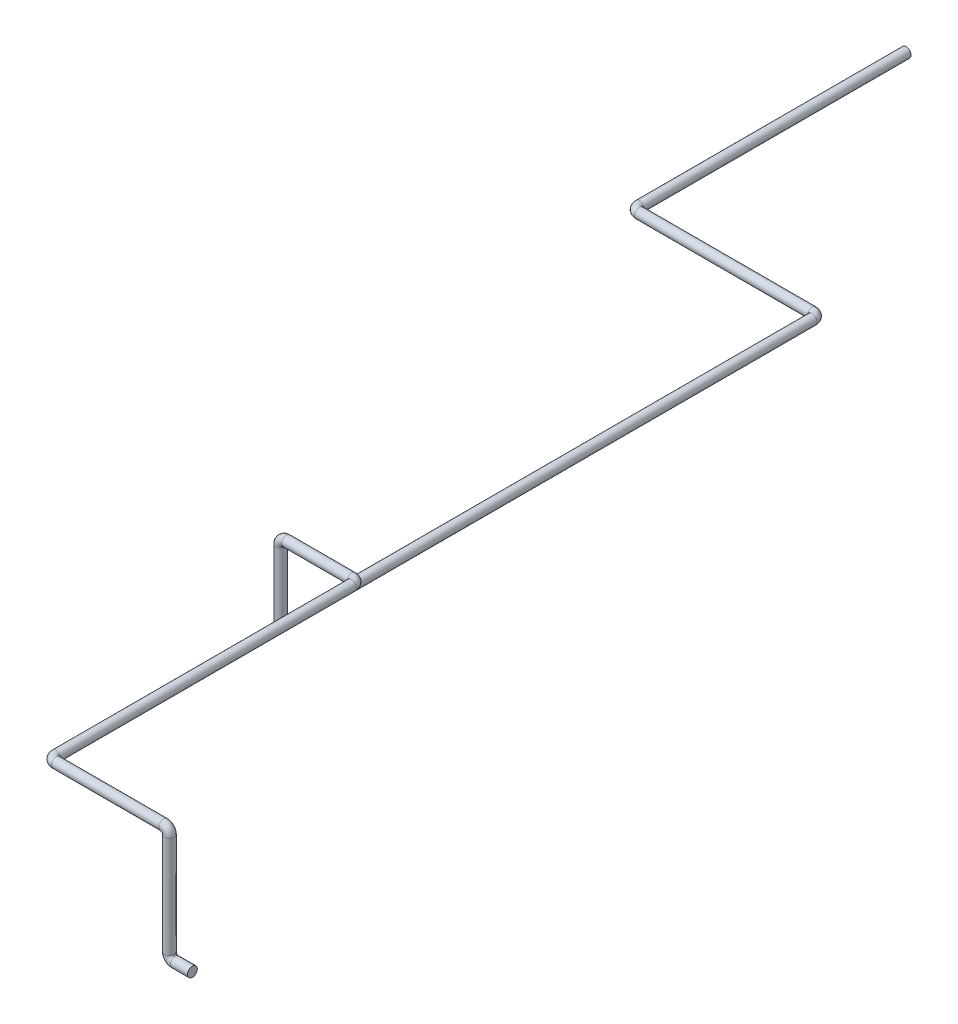
ISO-10303-21;
HEADER;
FILE_DESCRIPTION(('STEP AP214'),'2;1');
FILE_NAME('part.step','',(''),(''),'','','');
FILE_SCHEMA(('AUTOMOTIVE_DESIGN { 1 0 10303 214 1 1 1 1 }'));
ENDSEC;
DATA;
#1=APPLICATION_CONTEXT('core data for automotive mechanical design processes');
#2=APPLICATION_PROTOCOL_DEFINITION('international standard','automotive_design',2000,#1);
#3=PRODUCT_CONTEXT('',#1,'mechanical');
#4=PRODUCT('Part','Part','',(#3));
#5=PRODUCT_RELATED_PRODUCT_CATEGORY('part','',(#4));
#6=PRODUCT_DEFINITION_FORMATION('','',#4);
#7=PRODUCT_DEFINITION_CONTEXT('part definition',#1,'design');
#8=PRODUCT_DEFINITION('design','',#6,#7);
#9=PRODUCT_DEFINITION_SHAPE('','',#8);
#10=(LENGTH_UNIT() NAMED_UNIT(*) SI_UNIT(.MILLI.,.METRE.));
#11=(NAMED_UNIT(*) PLANE_ANGLE_UNIT() SI_UNIT($,.RADIAN.));
#12=(NAMED_UNIT(*) SI_UNIT($,.STERADIAN.) SOLID_ANGLE_UNIT());
#13=UNCERTAINTY_MEASURE_WITH_UNIT(LENGTH_MEASURE(1.E-05),#10,'distance_accuracy_value','');
#14=(GEOMETRIC_REPRESENTATION_CONTEXT(3) GLOBAL_UNCERTAINTY_ASSIGNED_CONTEXT((#13)) GLOBAL_UNIT_ASSIGNED_CONTEXT((#10,
#11,#12)) REPRESENTATION_CONTEXT('',''));
#15=CARTESIAN_POINT('',(0.,0.,0.));
#16=DIRECTION('',(0.,0.,1.));
#17=DIRECTION('',(1.,0.,0.));
#18=AXIS2_PLACEMENT_3D('',#15,#16,#17);
#19=CARTESIAN_POINT('',(0.,0.,10.));
#20=DIRECTION('',(0.,0.,-1.));
#21=DIRECTION('',(-1.,0.,0.));
#22=AXIS2_PLACEMENT_3D('',#19,#20,#21);
#23=CYLINDRICAL_SURFACE('',#22,12.7);
#24=CARTESIAN_POINT('',(0.,0.,0.999999999999999));
#25=DIRECTION('',(0.,0.,1.));
#26=DIRECTION('',(1.,0.,0.));
#27=AXIS2_PLACEMENT_3D('',#24,#25,#26);
#28=CIRCLE('',#27,12.7);
#29=CARTESIAN_POINT('',(0.0462735866728176,12.6999156987429,0.999999999999999));
#30=VERTEX_POINT('',#29);
#31=CARTESIAN_POINT('',(-0.0462735866728176,12.6999156987429,0.999999999999999));
#32=VERTEX_POINT('',#31);
#33=EDGE_CURVE('E11',#30,#32,#28,.T.);
#34=ORIENTED_EDGE('',*,*,#33,.T.);
#35=DIRECTION('',(0.,0.,-1.));
#36=VECTOR('',#35,1.);
#37=CARTESIAN_POINT('',(-0.0462735866728176,12.6999156987429,10.));
#38=LINE('',#37,#36);
#39=CARTESIAN_POINT('',(-0.0462735866728176,12.6999156987429,0.));
#40=VERTEX_POINT('',#39);
#41=EDGE_CURVE('E81',#32,#40,#38,.T.);
#42=ORIENTED_EDGE('',*,*,#41,.T.);
#43=CARTESIAN_POINT('',(0.,0.,0.));
#44=DIRECTION('',(0.,0.,1.));
#45=DIRECTION('',(1.,0.,0.));
#46=AXIS2_PLACEMENT_3D('',#43,#44,#45);
#47=CIRCLE('',#46,12.7);
#48=CARTESIAN_POINT('',(0.0462735866728176,12.6999156987429,0.));
#49=VERTEX_POINT('',#48);
#50=EDGE_CURVE('E42',#40,#49,#47,.T.);
#51=ORIENTED_EDGE('',*,*,#50,.T.);
#52=DIRECTION('',(0.,0.,-1.));
#53=VECTOR('',#52,1.);
#54=CARTESIAN_POINT('',(0.0462735866728176,12.6999156987429,10.));
#55=LINE('',#54,#53);
#56=EDGE_CURVE('E52',#49,#30,#55,.F.);
#57=ORIENTED_EDGE('',*,*,#56,.T.);
#58=EDGE_LOOP('',(#34,#42,#51,#57));
#59=FACE_BOUND('',#58,.T.);
#60=CARTESIAN_POINT('',(0.,0.,695.));
#61=DIRECTION('',(0.,0.,1.));
#62=DIRECTION('',(1.,0.,0.));
#63=AXIS2_PLACEMENT_3D('',#60,#61,#62);
#64=CIRCLE('',#63,12.7);
#65=CARTESIAN_POINT('',(-12.7000000000001,0.,695.));
#66=VERTEX_POINT('',#65);
#67=EDGE_CURVE('E109',#66,#66,#64,.T.);
#68=ORIENTED_EDGE('',*,*,#67,.F.);
#69=EDGE_LOOP('',(#68));
#70=FACE_BOUND('',#69,.T.);
#71=ADVANCED_FACE('F35',(#59,#70),#23,.T.);
#72=CARTESIAN_POINT('',(0.,0.,0.));
#73=DIRECTION('',(0.,0.,1.));
#74=DIRECTION('',(1.,0.,0.));
#75=AXIS2_PLACEMENT_3D('',#72,#73,#74);
#76=PLANE('',#75);
#77=ORIENTED_EDGE('',*,*,#50,.F.);
#78=DIRECTION('',(0.,1.,0.));
#79=VECTOR('',#78,1.);
#80=CARTESIAN_POINT('',(-0.0462735866728176,12.675138552317,0.));
#81=LINE('',#80,#79);
#82=CARTESIAN_POINT('',(-0.0462735866728176,12.724861447683,0.));
#83=VERTEX_POINT('',#82);
#84=EDGE_CURVE('E101',#40,#83,#81,.T.);
#85=ORIENTED_EDGE('',*,*,#84,.T.);
#86=DIRECTION('',(1.,0.,0.));
#87=VECTOR('',#86,1.);
#88=CARTESIAN_POINT('',(0.0462735866728176,12.724861447683,0.));
#89=LINE('',#88,#87);
#90=CARTESIAN_POINT('',(0.0462735866728176,12.724861447683,0.));
#91=VERTEX_POINT('',#90);
#92=EDGE_CURVE('E91',#83,#91,#89,.T.);
#93=ORIENTED_EDGE('',*,*,#92,.T.);
#94=DIRECTION('',(0.,-1.,0.));
#95=VECTOR('',#94,1.);
#96=CARTESIAN_POINT('',(0.0462735866728176,12.675138552317,0.));
#97=LINE('',#96,#95);
#98=EDGE_CURVE('E85',#91,#49,#97,.T.);
#99=ORIENTED_EDGE('',*,*,#98,.T.);
#100=EDGE_LOOP('',(#77,#85,#93,#99));
#101=FACE_BOUND('',#100,.T.);
#102=ADVANCED_FACE('F163',(#101),#76,.F.);
#103=CARTESIAN_POINT('',(1050.,-95.,2910.));
#104=DIRECTION('',(1.,0.,0.));
#105=DIRECTION('',(0.,-1.,0.));
#106=AXIS2_PLACEMENT_3D('',#103,#104,#105);
#107=PLANE('',#106);
#108=CARTESIAN_POINT('',(1050.,-95.,2910.));
#109=DIRECTION('',(1.,0.,0.));
#110=DIRECTION('',(0.,-1.,0.));
#111=AXIS2_PLACEMENT_3D('',#108,#109,#110);
#112=CIRCLE('',#111,12.7);
#113=CARTESIAN_POINT('',(1050.,-107.7,2910.));
#114=VERTEX_POINT('',#113);
#115=EDGE_CURVE('E157',#114,#114,#112,.T.);
#116=ORIENTED_EDGE('',*,*,#115,.T.);
#117=EDGE_LOOP('',(#116));
#118=FACE_BOUND('',#117,.T.);
#119=ADVANCED_FACE('F165',(#118),#107,.T.);
#120=CARTESIAN_POINT('',(15.,0.,695.));
#121=DIRECTION('',(0.,1.,0.));
#122=DIRECTION('',(0.,0.,1.));
#123=AXIS2_PLACEMENT_3D('',#120,#121,#122);
#124=TOROIDAL_SURFACE('',#123,15.0000000000001,12.7);
#125=CARTESIAN_POINT('',(15.,0.,710.));
#126=DIRECTION('',(1.,0.,0.));
#127=DIRECTION('',(0.,0.,-1.));
#128=AXIS2_PLACEMENT_3D('',#125,#126,#127);
#129=CIRCLE('',#128,12.7);
#130=CARTESIAN_POINT('',(15.,0.,722.7));
#131=VERTEX_POINT('',#130);
#132=EDGE_CURVE('E112',#131,#131,#129,.T.);
#133=CARTESIAN_POINT('',(15.,0.,695.));
#134=DIRECTION('',(0.,1.,0.));
#135=DIRECTION('',(0.,0.,1.));
#136=AXIS2_PLACEMENT_3D('',#133,#134,#135);
#137=CIRCLE('',#136,27.7000000000001);
#138=EDGE_CURVE('',#66,#131,#137,.T.);
#139=ORIENTED_EDGE('',*,*,#67,.T.);
#140=ORIENTED_EDGE('',*,*,#132,.F.);
#141=ORIENTED_EDGE('',*,*,#138,.T.);
#142=ORIENTED_EDGE('',*,*,#138,.F.);
#143=EDGE_LOOP('',(#139,#141,#140,#142));
#144=FACE_BOUND('',#143,.T.);
#145=ADVANCED_FACE('F171',(#144),#124,.T.);
#146=CARTESIAN_POINT('',(15.,0.,710.));
#147=DIRECTION('',(1.,0.,0.));
#148=DIRECTION('',(0.,0.,-1.));
#149=AXIS2_PLACEMENT_3D('',#146,#147,#148);
#150=CYLINDRICAL_SURFACE('',#149,12.7);
#151=CARTESIAN_POINT('',(465.,0.,710.));
#152=DIRECTION('',(1.,0.,0.));
#153=DIRECTION('',(0.,0.,-1.));
#154=AXIS2_PLACEMENT_3D('',#151,#152,#153);
#155=CIRCLE('',#154,12.7);
#156=CARTESIAN_POINT('',(465.,0.,697.3));
#157=VERTEX_POINT('',#156);
#158=EDGE_CURVE('E115',#157,#157,#155,.T.);
#159=ORIENTED_EDGE('',*,*,#158,.F.);
#160=EDGE_LOOP('',(#159));
#161=FACE_BOUND('',#160,.T.);
#162=ORIENTED_EDGE('',*,*,#132,.T.);
#163=EDGE_LOOP('',(#162));
#164=FACE_BOUND('',#163,.T.);
#165=ADVANCED_FACE('F235',(#161,#164),#150,.T.);
#166=CARTESIAN_POINT('',(465.,0.,725.));
#167=DIRECTION('',(0.,-1.,0.));
#168=DIRECTION('',(0.,0.,-1.));
#169=AXIS2_PLACEMENT_3D('',#166,#167,#168);
#170=TOROIDAL_SURFACE('',#169,15.,12.7);
#171=CARTESIAN_POINT('',(480.,0.,725.));
#172=DIRECTION('',(0.,0.,1.));
#173=DIRECTION('',(1.,0.,0.));
#174=AXIS2_PLACEMENT_3D('',#171,#172,#173);
#175=CIRCLE('',#174,12.7);
#176=CARTESIAN_POINT('',(492.7,0.,725.));
#177=VERTEX_POINT('',#176);
#178=EDGE_CURVE('E118',#177,#177,#175,.T.);
#179=CARTESIAN_POINT('',(465.,0.,725.));
#180=DIRECTION('',(0.,-1.,0.));
#181=DIRECTION('',(0.,0.,-1.));
#182=AXIS2_PLACEMENT_3D('',#179,#180,#181);
#183=CIRCLE('',#182,27.7);
#184=EDGE_CURVE('',#157,#177,#183,.T.);
#185=ORIENTED_EDGE('',*,*,#158,.T.);
#186=ORIENTED_EDGE('',*,*,#178,.F.);
#187=ORIENTED_EDGE('',*,*,#184,.T.);
#188=ORIENTED_EDGE('',*,*,#184,.F.);
#189=EDGE_LOOP('',(#185,#187,#186,#188));
#190=FACE_BOUND('',#189,.T.);
#191=ADVANCED_FACE('F231',(#190),#170,.T.);
#192=CARTESIAN_POINT('',(480.,0.,725.));
#193=DIRECTION('',(0.,0.,1.));
#194=DIRECTION('',(1.,0.,0.));
#195=AXIS2_PLACEMENT_3D('',#192,#193,#194);
#196=CYLINDRICAL_SURFACE('',#195,12.7);
#197=CARTESIAN_POINT('',(480.,0.,2095.));
#198=DIRECTION('',(0.,0.,1.));
#199=DIRECTION('',(1.,0.,0.));
#200=AXIS2_PLACEMENT_3D('',#197,#198,#199);
#201=CIRCLE('',#200,12.7);
#202=CARTESIAN_POINT('',(480.,-12.7000000000004,2095.));
#203=VERTEX_POINT('',#202);
#204=EDGE_CURVE('E121',#203,#203,#201,.T.);
#205=ORIENTED_EDGE('',*,*,#204,.F.);
#206=EDGE_LOOP('',(#205));
#207=FACE_BOUND('',#206,.T.);
#208=ORIENTED_EDGE('',*,*,#178,.T.);
#209=EDGE_LOOP('',(#208));
#210=FACE_BOUND('',#209,.T.);
#211=ADVANCED_FACE('F227',(#207,#210),#196,.T.);
#212=CARTESIAN_POINT('',(480.,15.,2095.));
#213=DIRECTION('',(-1.,0.,0.));
#214=DIRECTION('',(0.,0.,1.));
#215=AXIS2_PLACEMENT_3D('',#212,#213,#214);
#216=TOROIDAL_SURFACE('',#215,15.0000000000004,12.7);
#217=CARTESIAN_POINT('',(480.,15.,2110.));
#218=DIRECTION('',(0.,1.,0.));
#219=DIRECTION('',(1.,0.,0.));
#220=AXIS2_PLACEMENT_3D('',#217,#218,#219);
#221=CIRCLE('',#220,12.7);
#222=CARTESIAN_POINT('',(480.,15.,2122.7));
#223=VERTEX_POINT('',#222);
#224=EDGE_CURVE('E124',#223,#223,#221,.T.);
#225=CARTESIAN_POINT('',(480.,15.,2095.));
#226=DIRECTION('',(-1.,0.,0.));
#227=DIRECTION('',(0.,0.,1.));
#228=AXIS2_PLACEMENT_3D('',#225,#226,#227);
#229=CIRCLE('',#228,27.7000000000004);
#230=EDGE_CURVE('',#203,#223,#229,.T.);
#231=ORIENTED_EDGE('',*,*,#204,.T.);
#232=ORIENTED_EDGE('',*,*,#224,.F.);
#233=ORIENTED_EDGE('',*,*,#230,.T.);
#234=ORIENTED_EDGE('',*,*,#230,.F.);
#235=EDGE_LOOP('',(#231,#233,#232,#234));
#236=FACE_BOUND('',#235,.T.);
#237=ADVANCED_FACE('F223',(#236),#216,.T.);
#238=CARTESIAN_POINT('',(480.,15.,2110.));
#239=DIRECTION('',(0.,1.,0.));
#240=DIRECTION('',(0.,0.,1.));
#241=AXIS2_PLACEMENT_3D('',#238,#239,#240);
#242=CYLINDRICAL_SURFACE('',#241,12.7);
#243=CARTESIAN_POINT('',(480.,185.,2110.));
#244=DIRECTION('',(0.,1.,0.));
#245=DIRECTION('',(1.,0.,0.));
#246=AXIS2_PLACEMENT_3D('',#243,#244,#245);
#247=CIRCLE('',#246,12.7);
#248=CARTESIAN_POINT('',(467.3,185.,2110.));
#249=VERTEX_POINT('',#248);
#250=EDGE_CURVE('E127',#249,#249,#247,.T.);
#251=ORIENTED_EDGE('',*,*,#250,.F.);
#252=EDGE_LOOP('',(#251));
#253=FACE_BOUND('',#252,.T.);
#254=ORIENTED_EDGE('',*,*,#224,.T.);
#255=EDGE_LOOP('',(#254));
#256=FACE_BOUND('',#255,.T.);
#257=ADVANCED_FACE('F219',(#253,#256),#242,.T.);
#258=CARTESIAN_POINT('',(495.,185.,2110.));
#259=DIRECTION('',(0.,0.,-1.));
#260=DIRECTION('',(-1.,0.,0.));
#261=AXIS2_PLACEMENT_3D('',#258,#259,#260);
#262=TOROIDAL_SURFACE('',#261,15.,12.7);
#263=CARTESIAN_POINT('',(495.,200.,2110.));
#264=DIRECTION('',(1.,0.,0.));
#265=DIRECTION('',(0.,-1.,0.));
#266=AXIS2_PLACEMENT_3D('',#263,#264,#265);
#267=CIRCLE('',#266,12.7);
#268=CARTESIAN_POINT('',(495.,212.7,2110.));
#269=VERTEX_POINT('',#268);
#270=EDGE_CURVE('E130',#269,#269,#267,.T.);
#271=CARTESIAN_POINT('',(495.,185.,2110.));
#272=DIRECTION('',(0.,0.,-1.));
#273=DIRECTION('',(-1.,0.,0.));
#274=AXIS2_PLACEMENT_3D('',#271,#272,#273);
#275=CIRCLE('',#274,27.7);
#276=EDGE_CURVE('',#249,#269,#275,.T.);
#277=ORIENTED_EDGE('',*,*,#250,.T.);
#278=ORIENTED_EDGE('',*,*,#270,.F.);
#279=ORIENTED_EDGE('',*,*,#276,.T.);
#280=ORIENTED_EDGE('',*,*,#276,.F.);
#281=EDGE_LOOP('',(#277,#279,#278,#280));
#282=FACE_BOUND('',#281,.T.);
#283=ADVANCED_FACE('F215',(#282),#262,.T.);
#284=CARTESIAN_POINT('',(495.,200.,2110.));
#285=DIRECTION('',(1.,0.,0.));
#286=DIRECTION('',(0.,0.,-1.));
#287=AXIS2_PLACEMENT_3D('',#284,#285,#286);
#288=CYLINDRICAL_SURFACE('',#287,12.7);
#289=CARTESIAN_POINT('',(665.,200.,2110.));
#290=DIRECTION('',(1.,0.,0.));
#291=DIRECTION('',(0.,-1.,0.));
#292=AXIS2_PLACEMENT_3D('',#289,#290,#291);
#293=CIRCLE('',#292,12.7);
#294=CARTESIAN_POINT('',(665.,200.,2097.3));
#295=VERTEX_POINT('',#294);
#296=EDGE_CURVE('E133',#295,#295,#293,.T.);
#297=ORIENTED_EDGE('',*,*,#296,.F.);
#298=EDGE_LOOP('',(#297));
#299=FACE_BOUND('',#298,.T.);
#300=ORIENTED_EDGE('',*,*,#270,.T.);
#301=EDGE_LOOP('',(#300));
#302=FACE_BOUND('',#301,.T.);
#303=ADVANCED_FACE('F211',(#299,#302),#288,.T.);
#304=CARTESIAN_POINT('',(665.,200.,2125.));
#305=DIRECTION('',(0.,-1.,0.));
#306=DIRECTION('',(0.,0.,-1.));
#307=AXIS2_PLACEMENT_3D('',#304,#305,#306);
#308=TOROIDAL_SURFACE('',#307,15.0000000000001,12.7);
#309=CARTESIAN_POINT('',(680.,200.,2125.));
#310=DIRECTION('',(0.,0.,1.));
#311=DIRECTION('',(0.,-1.,0.));
#312=AXIS2_PLACEMENT_3D('',#309,#310,#311);
#313=CIRCLE('',#312,12.7);
#314=CARTESIAN_POINT('',(692.7,200.,2125.));
#315=VERTEX_POINT('',#314);
#316=EDGE_CURVE('E136',#315,#315,#313,.T.);
#317=CARTESIAN_POINT('',(665.,200.,2125.));
#318=DIRECTION('',(0.,-1.,0.));
#319=DIRECTION('',(0.,0.,-1.));
#320=AXIS2_PLACEMENT_3D('',#317,#318,#319);
#321=CIRCLE('',#320,27.7000000000001);
#322=EDGE_CURVE('',#295,#315,#321,.T.);
#323=ORIENTED_EDGE('',*,*,#296,.T.);
#324=ORIENTED_EDGE('',*,*,#316,.F.);
#325=ORIENTED_EDGE('',*,*,#322,.T.);
#326=ORIENTED_EDGE('',*,*,#322,.F.);
#327=EDGE_LOOP('',(#323,#325,#324,#326));
#328=FACE_BOUND('',#327,.T.);
#329=ADVANCED_FACE('F207',(#328),#308,.T.);
#330=CARTESIAN_POINT('',(680.,200.,2125.));
#331=DIRECTION('',(0.,0.,1.));
#332=DIRECTION('',(1.,0.,0.));
#333=AXIS2_PLACEMENT_3D('',#330,#331,#332);
#334=CYLINDRICAL_SURFACE('',#333,12.7);
#335=CARTESIAN_POINT('',(680.,200.,2895.));
#336=DIRECTION('',(0.,0.,1.));
#337=DIRECTION('',(0.,-1.,0.));
#338=AXIS2_PLACEMENT_3D('',#335,#336,#337);
#339=CIRCLE('',#338,12.7);
#340=CARTESIAN_POINT('',(667.3,200.,2895.));
#341=VERTEX_POINT('',#340);
#342=EDGE_CURVE('E139',#341,#341,#339,.T.);
#343=ORIENTED_EDGE('',*,*,#342,.F.);
#344=EDGE_LOOP('',(#343));
#345=FACE_BOUND('',#344,.T.);
#346=ORIENTED_EDGE('',*,*,#316,.T.);
#347=EDGE_LOOP('',(#346));
#348=FACE_BOUND('',#347,.T.);
#349=ADVANCED_FACE('F203',(#345,#348),#334,.T.);
#350=CARTESIAN_POINT('',(695.,200.,2895.));
#351=DIRECTION('',(0.,1.,0.));
#352=DIRECTION('',(0.,0.,1.));
#353=AXIS2_PLACEMENT_3D('',#350,#351,#352);
#354=TOROIDAL_SURFACE('',#353,15.,12.7);
#355=CARTESIAN_POINT('',(695.,200.,2910.));
#356=DIRECTION('',(1.,0.,0.));
#357=DIRECTION('',(0.,-1.,0.));
#358=AXIS2_PLACEMENT_3D('',#355,#356,#357);
#359=CIRCLE('',#358,12.7);
#360=CARTESIAN_POINT('',(695.,200.,2922.7));
#361=VERTEX_POINT('',#360);
#362=EDGE_CURVE('E142',#361,#361,#359,.T.);
#363=CARTESIAN_POINT('',(695.,200.,2895.));
#364=DIRECTION('',(0.,1.,0.));
#365=DIRECTION('',(0.,0.,1.));
#366=AXIS2_PLACEMENT_3D('',#363,#364,#365);
#367=CIRCLE('',#366,27.7);
#368=EDGE_CURVE('',#341,#361,#367,.T.);
#369=ORIENTED_EDGE('',*,*,#342,.T.);
#370=ORIENTED_EDGE('',*,*,#362,.F.);
#371=ORIENTED_EDGE('',*,*,#368,.T.);
#372=ORIENTED_EDGE('',*,*,#368,.F.);
#373=EDGE_LOOP('',(#369,#371,#370,#372));
#374=FACE_BOUND('',#373,.T.);
#375=ADVANCED_FACE('F199',(#374),#354,.T.);
#376=CARTESIAN_POINT('',(695.,200.,2910.));
#377=DIRECTION('',(1.,0.,0.));
#378=DIRECTION('',(0.,0.,-1.));
#379=AXIS2_PLACEMENT_3D('',#376,#377,#378);
#380=CYLINDRICAL_SURFACE('',#379,12.7);
#381=CARTESIAN_POINT('',(975.,200.,2910.));
#382=DIRECTION('',(1.,0.,0.));
#383=DIRECTION('',(0.,-1.,0.));
#384=AXIS2_PLACEMENT_3D('',#381,#382,#383);
#385=CIRCLE('',#384,12.7);
#386=CARTESIAN_POINT('',(975.,212.7,2910.));
#387=VERTEX_POINT('',#386);
#388=EDGE_CURVE('E145',#387,#387,#385,.T.);
#389=ORIENTED_EDGE('',*,*,#388,.F.);
#390=EDGE_LOOP('',(#389));
#391=FACE_BOUND('',#390,.T.);
#392=ORIENTED_EDGE('',*,*,#362,.T.);
#393=EDGE_LOOP('',(#392));
#394=FACE_BOUND('',#393,.T.);
#395=ADVANCED_FACE('F195',(#391,#394),#380,.T.);
#396=CARTESIAN_POINT('',(975.,185.,2910.));
#397=DIRECTION('',(0.,0.,-1.));
#398=DIRECTION('',(-1.,0.,0.));
#399=AXIS2_PLACEMENT_3D('',#396,#397,#398);
#400=TOROIDAL_SURFACE('',#399,15.,12.7);
#401=CARTESIAN_POINT('',(990.,185.,2910.));
#402=DIRECTION('',(0.,-1.,0.));
#403=DIRECTION('',(-1.,0.,0.));
#404=AXIS2_PLACEMENT_3D('',#401,#402,#403);
#405=CIRCLE('',#404,12.7);
#406=CARTESIAN_POINT('',(1002.7,185.,2910.));
#407=VERTEX_POINT('',#406);
#408=EDGE_CURVE('E148',#407,#407,#405,.T.);
#409=CARTESIAN_POINT('',(975.,185.,2910.));
#410=DIRECTION('',(0.,0.,-1.));
#411=DIRECTION('',(-1.,0.,0.));
#412=AXIS2_PLACEMENT_3D('',#409,#410,#411);
#413=CIRCLE('',#412,27.7);
#414=EDGE_CURVE('',#387,#407,#413,.T.);
#415=ORIENTED_EDGE('',*,*,#388,.T.);
#416=ORIENTED_EDGE('',*,*,#408,.F.);
#417=ORIENTED_EDGE('',*,*,#414,.T.);
#418=ORIENTED_EDGE('',*,*,#414,.F.);
#419=EDGE_LOOP('',(#415,#417,#416,#418));
#420=FACE_BOUND('',#419,.T.);
#421=ADVANCED_FACE('F191',(#420),#400,.T.);
#422=CARTESIAN_POINT('',(990.,185.,2910.));
#423=DIRECTION('',(0.,-1.,0.));
#424=DIRECTION('',(0.,0.,-1.));
#425=AXIS2_PLACEMENT_3D('',#422,#423,#424);
#426=CYLINDRICAL_SURFACE('',#425,12.7);
#427=CARTESIAN_POINT('',(990.,-80.,2910.));
#428=DIRECTION('',(0.,-1.,0.));
#429=DIRECTION('',(-1.,0.,0.));
#430=AXIS2_PLACEMENT_3D('',#427,#428,#429);
#431=CIRCLE('',#430,12.7);
#432=CARTESIAN_POINT('',(977.3,-79.9999999999999,2910.));
#433=VERTEX_POINT('',#432);
#434=EDGE_CURVE('E151',#433,#433,#431,.T.);
#435=ORIENTED_EDGE('',*,*,#434,.F.);
#436=EDGE_LOOP('',(#435));
#437=FACE_BOUND('',#436,.T.);
#438=ORIENTED_EDGE('',*,*,#408,.T.);
#439=EDGE_LOOP('',(#438));
#440=FACE_BOUND('',#439,.T.);
#441=ADVANCED_FACE('F183',(#437,#440),#426,.T.);
#442=CARTESIAN_POINT('',(1005.,-80.,2910.));
#443=DIRECTION('',(0.,0.,1.));
#444=DIRECTION('',(1.,0.,0.));
#445=AXIS2_PLACEMENT_3D('',#442,#443,#444);
#446=TOROIDAL_SURFACE('',#445,14.9999999999999,12.7);
#447=CARTESIAN_POINT('',(1005.,-94.9999999999999,2910.));
#448=DIRECTION('',(1.,0.,0.));
#449=DIRECTION('',(0.,-1.,0.));
#450=AXIS2_PLACEMENT_3D('',#447,#448,#449);
#451=CIRCLE('',#450,12.7);
#452=CARTESIAN_POINT('',(1005.,-107.7,2910.));
#453=VERTEX_POINT('',#452);
#454=EDGE_CURVE('E154',#453,#453,#451,.T.);
#455=CARTESIAN_POINT('',(1005.,-80.,2910.));
#456=DIRECTION('',(0.,0.,1.));
#457=DIRECTION('',(1.,0.,0.));
#458=AXIS2_PLACEMENT_3D('',#455,#456,#457);
#459=CIRCLE('',#458,27.6999999999999);
#460=EDGE_CURVE('',#433,#453,#459,.T.);
#461=ORIENTED_EDGE('',*,*,#434,.T.);
#462=ORIENTED_EDGE('',*,*,#454,.F.);
#463=ORIENTED_EDGE('',*,*,#460,.T.);
#464=ORIENTED_EDGE('',*,*,#460,.F.);
#465=EDGE_LOOP('',(#461,#463,#462,#464));
#466=FACE_BOUND('',#465,.T.);
#467=ADVANCED_FACE('F175',(#466),#446,.T.);
#468=CARTESIAN_POINT('',(1005.,-95.,2910.));
#469=DIRECTION('',(1.,0.,0.));
#470=DIRECTION('',(0.,0.,-1.));
#471=AXIS2_PLACEMENT_3D('',#468,#469,#470);
#472=CYLINDRICAL_SURFACE('',#471,12.7);
#473=ORIENTED_EDGE('',*,*,#115,.F.);
#474=EDGE_LOOP('',(#473));
#475=FACE_BOUND('',#474,.T.);
#476=ORIENTED_EDGE('',*,*,#454,.T.);
#477=EDGE_LOOP('',(#476));
#478=FACE_BOUND('',#477,.T.);
#479=ADVANCED_FACE('F166',(#475,#478),#472,.T.);
#480=CARTESIAN_POINT('',(-0.0462735866728176,12.675138552317,1.));
#481=DIRECTION('',(-1.,0.,0.));
#482=DIRECTION('',(0.,0.,1.));
#483=AXIS2_PLACEMENT_3D('',#480,#481,#482);
#484=PLANE('',#483);
#485=ORIENTED_EDGE('',*,*,#41,.F.);
#486=DIRECTION('',(0.,1.,0.));
#487=VECTOR('',#486,1.);
#488=CARTESIAN_POINT('',(-0.0462735866728176,12.675138552317,1.));
#489=LINE('',#488,#487);
#490=CARTESIAN_POINT('',(-0.0462735866728176,12.724861447683,1.));
#491=VERTEX_POINT('',#490);
#492=EDGE_CURVE('E75',#32,#491,#489,.T.);
#493=ORIENTED_EDGE('',*,*,#492,.T.);
#494=DIRECTION('',(0.,0.,-1.));
#495=VECTOR('',#494,1.);
#496=CARTESIAN_POINT('',(-0.0462735866728176,12.724861447683,1.));
#497=LINE('',#496,#495);
#498=EDGE_CURVE('E79',#491,#83,#497,.T.);
#499=ORIENTED_EDGE('',*,*,#498,.T.);
#500=ORIENTED_EDGE('',*,*,#84,.F.);
#501=EDGE_LOOP('',(#485,#493,#499,#500));
#502=FACE_BOUND('',#501,.T.);
#503=ADVANCED_FACE('F77',(#502),#484,.T.);
#504=CARTESIAN_POINT('',(0.0462735866728176,12.675138552317,1.));
#505=DIRECTION('',(1.,0.,0.));
#506=DIRECTION('',(0.,0.,-1.));
#507=AXIS2_PLACEMENT_3D('',#504,#505,#506);
#508=PLANE('',#507);
#509=ORIENTED_EDGE('',*,*,#56,.F.);
#510=ORIENTED_EDGE('',*,*,#98,.F.);
#511=DIRECTION('',(0.,0.,-1.));
#512=VECTOR('',#511,1.);
#513=CARTESIAN_POINT('',(0.0462735866728176,12.724861447683,1.));
#514=LINE('',#513,#512);
#515=CARTESIAN_POINT('',(0.0462735866728176,12.724861447683,1.));
#516=VERTEX_POINT('',#515);
#517=EDGE_CURVE('E92',#516,#91,#514,.T.);
#518=ORIENTED_EDGE('',*,*,#517,.F.);
#519=DIRECTION('',(0.,-1.,0.));
#520=VECTOR('',#519,1.);
#521=CARTESIAN_POINT('',(0.0462735866728176,12.675138552317,1.));
#522=LINE('',#521,#520);
#523=EDGE_CURVE('E93',#516,#30,#522,.T.);
#524=ORIENTED_EDGE('',*,*,#523,.T.);
#525=EDGE_LOOP('',(#509,#510,#518,#524));
#526=FACE_BOUND('',#525,.T.);
#527=ADVANCED_FACE('F162',(#526),#508,.T.);
#528=CARTESIAN_POINT('',(0.0462735866728176,12.724861447683,1.));
#529=DIRECTION('',(0.,1.,0.));
#530=DIRECTION('',(0.,0.,1.));
#531=AXIS2_PLACEMENT_3D('',#528,#529,#530);
#532=PLANE('',#531);
#533=ORIENTED_EDGE('',*,*,#92,.F.);
#534=ORIENTED_EDGE('',*,*,#498,.F.);
#535=DIRECTION('',(1.,0.,0.));
#536=VECTOR('',#535,1.);
#537=CARTESIAN_POINT('',(0.0462735866728176,12.724861447683,1.));
#538=LINE('',#537,#536);
#539=EDGE_CURVE('E84',#491,#516,#538,.T.);
#540=ORIENTED_EDGE('',*,*,#539,.T.);
#541=ORIENTED_EDGE('',*,*,#517,.T.);
#542=EDGE_LOOP('',(#533,#534,#540,#541));
#543=FACE_BOUND('',#542,.T.);
#544=ADVANCED_FACE('F89',(#543),#532,.T.);
#545=CARTESIAN_POINT('',(0.,0.,1.));
#546=DIRECTION('',(0.,0.,1.));
#547=DIRECTION('',(1.,0.,0.));
#548=AXIS2_PLACEMENT_3D('',#545,#546,#547);
#549=PLANE('',#548);
#550=ORIENTED_EDGE('',*,*,#33,.F.);
#551=ORIENTED_EDGE('',*,*,#523,.F.);
#552=ORIENTED_EDGE('',*,*,#539,.F.);
#553=ORIENTED_EDGE('',*,*,#492,.F.);
#554=EDGE_LOOP('',(#550,#551,#552,#553));
#555=FACE_BOUND('',#554,.T.);
#556=ADVANCED_FACE('F96',(#555),#549,.T.);
#557=CLOSED_SHELL('',(#71,#102,#119,#145,#165,#191,#211,#237,#257,#283,#303,#329,#349,#375,#395,
#421,#441,#467,#479,#503,#527,#544,#556));
#558=MANIFOLD_SOLID_BREP('B2',#557);
#559=ADVANCED_BREP_SHAPE_REPRESENTATION('',(#18,#558),#14);
#560=SHAPE_DEFINITION_REPRESENTATION(#9,#559);
ENDSEC;
END-ISO-10303-21;
